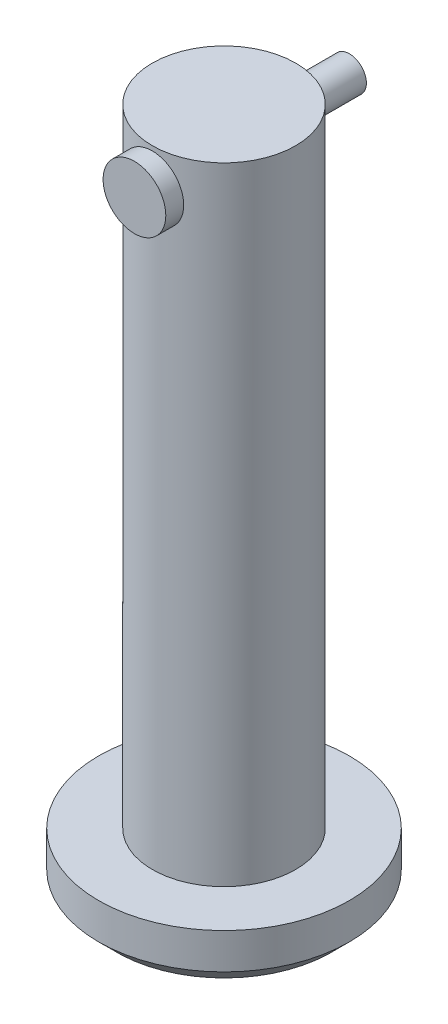
ISO-10303-21;
HEADER;
FILE_DESCRIPTION(('STEP AP214'),'2;1');
FILE_NAME('part.step','',(''),(''),'','','');
FILE_SCHEMA(('AUTOMOTIVE_DESIGN { 1 0 10303 214 1 1 1 1 }'));
ENDSEC;
DATA;
#1=APPLICATION_CONTEXT('core data for automotive mechanical design processes');
#2=APPLICATION_PROTOCOL_DEFINITION('international standard','automotive_design',2000,#1);
#3=PRODUCT_CONTEXT('',#1,'mechanical');
#4=PRODUCT('Part','Part','',(#3));
#5=PRODUCT_RELATED_PRODUCT_CATEGORY('part','',(#4));
#6=PRODUCT_DEFINITION_FORMATION('','',#4);
#7=PRODUCT_DEFINITION_CONTEXT('part definition',#1,'design');
#8=PRODUCT_DEFINITION('design','',#6,#7);
#9=PRODUCT_DEFINITION_SHAPE('','',#8);
#10=(LENGTH_UNIT() NAMED_UNIT(*) SI_UNIT(.MILLI.,.METRE.));
#11=(NAMED_UNIT(*) PLANE_ANGLE_UNIT() SI_UNIT($,.RADIAN.));
#12=(NAMED_UNIT(*) SI_UNIT($,.STERADIAN.) SOLID_ANGLE_UNIT());
#13=UNCERTAINTY_MEASURE_WITH_UNIT(LENGTH_MEASURE(1.E-05),#10,'distance_accuracy_value','');
#14=(GEOMETRIC_REPRESENTATION_CONTEXT(3) GLOBAL_UNCERTAINTY_ASSIGNED_CONTEXT((#13)) GLOBAL_UNIT_ASSIGNED_CONTEXT((#10,
#11,#12)) REPRESENTATION_CONTEXT('',''));
#15=CARTESIAN_POINT('',(0.,0.,0.));
#16=DIRECTION('',(0.,0.,1.));
#17=DIRECTION('',(1.,0.,0.));
#18=AXIS2_PLACEMENT_3D('',#15,#16,#17);
#19=CARTESIAN_POINT('',(0.,33.,-7.));
#20=DIRECTION('',(0.,0.,1.));
#21=DIRECTION('',(1.,0.,0.));
#22=AXIS2_PLACEMENT_3D('',#19,#20,#21);
#23=CYLINDRICAL_SURFACE('',#22,0.95);
#24=CARTESIAN_POINT('',(0.,33.,-7.));
#25=DIRECTION('',(0.,0.,1.));
#26=DIRECTION('',(1.,0.,0.));
#27=AXIS2_PLACEMENT_3D('',#24,#25,#26);
#28=CIRCLE('',#27,0.95);
#29=CARTESIAN_POINT('',(0.95,33.,-7.));
#30=VERTEX_POINT('',#29);
#31=EDGE_CURVE('E11',#30,#30,#28,.T.);
#32=ORIENTED_EDGE('',*,*,#31,.T.);
#33=EDGE_LOOP('',(#32));
#34=FACE_BOUND('',#33,.T.);
#35=CARTESIAN_POINT('',(0.,33.,4.));
#36=DIRECTION('',(0.,0.,1.));
#37=DIRECTION('',(1.,0.,0.));
#38=AXIS2_PLACEMENT_3D('',#35,#36,#37);
#39=CIRCLE('',#38,0.95);
#40=CARTESIAN_POINT('',(0.95,33.,4.));
#41=VERTEX_POINT('',#40);
#42=EDGE_CURVE('E41',#41,#41,#39,.F.);
#43=ORIENTED_EDGE('',*,*,#42,.T.);
#44=EDGE_LOOP('',(#43));
#45=FACE_BOUND('',#44,.T.);
#46=ADVANCED_FACE('F38',(#34,#45),#23,.T.);
#47=CARTESIAN_POINT('',(0.,33.,-7.));
#48=DIRECTION('',(0.,0.,1.));
#49=DIRECTION('',(1.,0.,0.));
#50=AXIS2_PLACEMENT_3D('',#47,#48,#49);
#51=PLANE('',#50);
#52=ORIENTED_EDGE('',*,*,#31,.F.);
#53=EDGE_LOOP('',(#52));
#54=FACE_BOUND('',#53,.T.);
#55=ADVANCED_FACE('F70',(#54),#51,.F.);
#56=CARTESIAN_POINT('',(0.,33.,4.));
#57=DIRECTION('',(0.,0.,1.));
#58=DIRECTION('',(1.,0.,0.));
#59=AXIS2_PLACEMENT_3D('',#56,#57,#58);
#60=CYLINDRICAL_SURFACE('',#59,1.75);
#61=CARTESIAN_POINT('',(0.,33.,4.));
#62=DIRECTION('',(0.,0.,1.));
#63=DIRECTION('',(1.,0.,0.));
#64=AXIS2_PLACEMENT_3D('',#61,#62,#63);
#65=CIRCLE('',#64,1.75);
#66=CARTESIAN_POINT('',(1.75,33.,4.));
#67=VERTEX_POINT('',#66);
#68=EDGE_CURVE('E48',#67,#67,#65,.T.);
#69=ORIENTED_EDGE('',*,*,#68,.T.);
#70=EDGE_LOOP('',(#69));
#71=FACE_BOUND('',#70,.T.);
#72=CARTESIAN_POINT('',(0.,33.,5.));
#73=DIRECTION('',(0.,0.,1.));
#74=DIRECTION('',(1.,0.,0.));
#75=AXIS2_PLACEMENT_3D('',#72,#73,#74);
#76=CIRCLE('',#75,1.75);
#77=CARTESIAN_POINT('',(1.75,33.,5.));
#78=VERTEX_POINT('',#77);
#79=EDGE_CURVE('E50',#78,#78,#76,.T.);
#80=ORIENTED_EDGE('',*,*,#79,.F.);
#81=EDGE_LOOP('',(#80));
#82=FACE_BOUND('',#81,.T.);
#83=ADVANCED_FACE('F56',(#71,#82),#60,.T.);
#84=CARTESIAN_POINT('',(0.,33.,4.));
#85=DIRECTION('',(0.,0.,1.));
#86=DIRECTION('',(1.,0.,0.));
#87=AXIS2_PLACEMENT_3D('',#84,#85,#86);
#88=PLANE('',#87);
#89=ORIENTED_EDGE('',*,*,#42,.F.);
#90=EDGE_LOOP('',(#89));
#91=FACE_BOUND('',#90,.T.);
#92=ORIENTED_EDGE('',*,*,#68,.F.);
#93=EDGE_LOOP('',(#92));
#94=FACE_BOUND('',#93,.T.);
#95=ADVANCED_FACE('F59',(#91,#94),#88,.F.);
#96=CARTESIAN_POINT('',(0.,33.,5.));
#97=DIRECTION('',(0.,0.,1.));
#98=DIRECTION('',(1.,0.,0.));
#99=AXIS2_PLACEMENT_3D('',#96,#97,#98);
#100=PLANE('',#99);
#101=ORIENTED_EDGE('',*,*,#79,.T.);
#102=EDGE_LOOP('',(#101));
#103=FACE_BOUND('',#102,.T.);
#104=ADVANCED_FACE('F61',(#103),#100,.T.);
#105=CLOSED_SHELL('',(#46,#55,#83,#95,#104));
#106=MANIFOLD_SOLID_BREP('B2',#105);
#107=CARTESIAN_POINT('',(0.,35.,0.));
#108=DIRECTION('',(0.,-1.,0.));
#109=DIRECTION('',(0.,0.,-1.));
#110=AXIS2_PLACEMENT_3D('',#107,#108,#109);
#111=CYLINDRICAL_SURFACE('',#110,4.);
#112=CARTESIAN_POINT('',(0.,35.,0.));
#113=DIRECTION('',(0.,1.,0.));
#114=DIRECTION('',(0.,0.,1.));
#115=AXIS2_PLACEMENT_3D('',#112,#113,#114);
#116=CIRCLE('',#115,4.);
#117=CARTESIAN_POINT('',(0.,35.,4.));
#118=VERTEX_POINT('',#117);
#119=EDGE_CURVE('E128',#118,#118,#116,.T.);
#120=ORIENTED_EDGE('',*,*,#119,.F.);
#121=EDGE_LOOP('',(#120));
#122=FACE_BOUND('',#121,.T.);
#123=CARTESIAN_POINT('',(0.,0.,0.));
#124=DIRECTION('',(0.,-1.,0.));
#125=DIRECTION('',(0.,0.,-1.));
#126=AXIS2_PLACEMENT_3D('',#123,#124,#125);
#127=CIRCLE('',#126,4.);
#128=CARTESIAN_POINT('',(0.,0.,-4.));
#129=VERTEX_POINT('',#128);
#130=EDGE_CURVE('E163',#129,#129,#127,.T.);
#131=ORIENTED_EDGE('',*,*,#130,.F.);
#132=EDGE_LOOP('',(#131));
#133=FACE_BOUND('',#132,.T.);
#134=CARTESIAN_POINT('',(-1.,33.,3.87298334620742));
#135=CARTESIAN_POINT('',(-0.9999984314387,32.9447796996432,3.87298440057185));
#136=CARTESIAN_POINT('',(-0.99541049820807,32.8895420405686,3.87417722499278));
#137=CARTESIAN_POINT('',(-0.977209250194447,32.7806529687674,3.87880744892249));
#138=CARTESIAN_POINT('',(-0.963590682698079,32.72700249822,3.8822461547418));
#139=CARTESIAN_POINT('',(-0.927796479849636,32.6228785847122,3.89095489813012));
#140=CARTESIAN_POINT('',(-0.905631891140942,32.5724011378422,3.8962225706936));
#141=CARTESIAN_POINT('',(-0.853408456505404,32.4758756589875,3.90799276818327));
#142=CARTESIAN_POINT('',(-0.823349275424504,32.4298278151688,3.91449534553241));
#143=CARTESIAN_POINT('',(-0.755483370924518,32.3424553418942,3.92816286540368));
#144=CARTESIAN_POINT('',(-0.717534755081558,32.3012425598597,3.93533839048709));
#145=CARTESIAN_POINT('',(-0.635272825640328,32.2256954422561,3.94945150206622));
#146=CARTESIAN_POINT('',(-0.59095891767214,32.1913617497514,3.95638906626691));
#147=CARTESIAN_POINT('',(-0.496458080431566,32.1300898129474,3.96936166208095));
#148=CARTESIAN_POINT('',(-0.446197830478045,32.1032614447354,3.975382749602));
#149=CARTESIAN_POINT('',(-0.341705273717112,32.0584761423388,3.9857232477043));
#150=CARTESIAN_POINT('',(-0.28747355431678,32.0405178992338,3.99004290933747));
#151=CARTESIAN_POINT('',(-0.177743503501667,32.0143408661686,3.99641903539262));
#152=CARTESIAN_POINT('',(-0.122293087819594,32.0059321422694,3.99851957537723));
#153=CARTESIAN_POINT('',(-0.0107315277051123,31.9984966482898,4.00037437642922));
#154=CARTESIAN_POINT('',(0.0453795178152228,31.9994684911162,4.00012898438682));
#155=CARTESIAN_POINT('',(0.155352247172383,32.0106299401001,3.99735237981413));
#156=CARTESIAN_POINT('',(0.209236215601063,32.0206145300215,3.99487200936349));
#157=CARTESIAN_POINT('',(0.314538247413683,32.0491885080194,3.98796334609942));
#158=CARTESIAN_POINT('',(0.365956179370436,32.067778354151,3.98353494959376));
#159=CARTESIAN_POINT('',(0.465406703501804,32.1132010282748,3.97315003880358));
#160=CARTESIAN_POINT('',(0.513404509766501,32.1401068178647,3.96718007878021));
#161=CARTESIAN_POINT('',(0.604275622340485,32.2013422716465,3.9543596152386));
#162=CARTESIAN_POINT('',(0.647148035085502,32.2356732274242,3.94750895860996));
#163=CARTESIAN_POINT('',(0.727774035084955,32.3118834967929,3.93345485507808));
#164=CARTESIAN_POINT('',(0.765357679075198,32.3539419569391,3.92624687810367));
#165=CARTESIAN_POINT('',(0.832976375963018,32.4438399894161,3.91246017406683));
#166=CARTESIAN_POINT('',(0.863011076046016,32.4916798317964,3.90588147642388));
#167=CARTESIAN_POINT('',(0.9147881290226,32.5921160136596,3.89408198732659));
#168=CARTESIAN_POINT('',(0.936489566970494,32.6447342921253,3.88886793490288));
#169=CARTESIAN_POINT('',(0.970685620636343,32.7530341872306,3.88047456055983));
#170=CARTESIAN_POINT('',(0.983182206552911,32.8087151455933,3.87729480324087));
#171=CARTESIAN_POINT('',(0.998331855466071,32.9199838006093,3.87342142415656));
#172=CARTESIAN_POINT('',(1.00123618956785,32.9755351173319,3.87266435637459));
#173=CARTESIAN_POINT('',(0.99780679620622,33.0863287746313,3.87354937392416));
#174=CARTESIAN_POINT('',(0.991473919139521,33.1415711431805,3.87519123840506));
#175=CARTESIAN_POINT('',(0.969970185575067,33.2492457059819,3.88062832781824));
#176=CARTESIAN_POINT('',(0.954945627312701,33.3017090906283,3.8843878809375));
#177=CARTESIAN_POINT('',(0.916647232668251,33.4033725831407,3.89360287308385));
#178=CARTESIAN_POINT('',(0.89337241908502,33.4525723036221,3.89905851299445));
#179=CARTESIAN_POINT('',(0.838708267174624,33.5473765111469,3.91118454837305));
#180=CARTESIAN_POINT('',(0.807168701534253,33.5928915360172,3.91787667442657));
#181=CARTESIAN_POINT('',(0.737060292934456,33.6780753451205,3.93166833228686));
#182=CARTESIAN_POINT('',(0.698490294805438,33.71774316666,3.93876793091388));
#183=CARTESIAN_POINT('',(0.614262720984725,33.7911244170284,3.95278961212643));
#184=CARTESIAN_POINT('',(0.568451952531594,33.8246640250195,3.95970280824734));
#185=CARTESIAN_POINT('',(0.47170268269468,33.8835743467805,3.97238886645493));
#186=CARTESIAN_POINT('',(0.420764448957597,33.9089454866433,3.97816178801584));
#187=CARTESIAN_POINT('',(0.315558201731097,33.9505784138112,3.98788046295326));
#188=CARTESIAN_POINT('',(0.261317381027888,33.9669057137516,3.99183932008964));
#189=CARTESIAN_POINT('',(0.150749760318812,33.9901841338434,3.99754117358315));
#190=CARTESIAN_POINT('',(0.094423365041247,33.9971370634956,3.99928459757363));
#191=CARTESIAN_POINT('',(-0.0170835264433241,34.0013675895755,4.00034169408811));
#192=CARTESIAN_POINT('',(-0.0722538269660308,33.9989017090954,3.99971978880008));
#193=CARTESIAN_POINT('',(-0.181367496414737,33.9849521727057,3.99625896457423));
#194=CARTESIAN_POINT('',(-0.235310901780883,33.9734687849869,3.99342011157094));
#195=CARTESIAN_POINT('',(-0.340171035644813,33.9419477802291,3.98585432853963));
#196=CARTESIAN_POINT('',(-0.391102494581017,33.9219565466854,3.98113764502669));
#197=CARTESIAN_POINT('',(-0.488917053041466,33.8740294209807,3.97031288913382));
#198=CARTESIAN_POINT('',(-0.535799641265048,33.8460925273304,3.96420464137727));
#199=CARTESIAN_POINT('',(-0.625401928423897,33.7822847660029,3.95107249681342));
#200=CARTESIAN_POINT('',(-0.667994988300584,33.7462398570926,3.94403016945647));
#201=CARTESIAN_POINT('',(-0.746615020271249,33.6675771480262,3.92990649053207));
#202=CARTESIAN_POINT('',(-0.782640325068177,33.6249576839021,3.92282512952424));
#203=CARTESIAN_POINT('',(-0.847762026479239,33.5333985857987,3.90927475860683));
#204=CARTESIAN_POINT('',(-0.876716619446591,33.4843558765875,3.90281963730391));
#205=CARTESIAN_POINT('',(-0.92592689661562,33.3819445100772,3.8914395555011));
#206=CARTESIAN_POINT('',(-0.946188909759556,33.3285790338927,3.88651348244814));
#207=CARTESIAN_POINT('',(-0.974422528565571,33.2294229881737,3.87951908741315));
#208=CARTESIAN_POINT('',(-0.983993170595829,33.1841068356176,3.87708663005761));
#209=CARTESIAN_POINT('',(-0.996782292572819,33.0925311309985,3.87381838580358));
#210=CARTESIAN_POINT('',(-1.00000131437052,33.0462716597494,3.87298246270639));
#211=CARTESIAN_POINT('',(-1.,33.,3.87298334620742));
#212=B_SPLINE_CURVE_WITH_KNOTS('',3,(#134,#135,#136,#137,#138,#139,#140,#141,#142,#143,#144,
#145,#146,#147,#148,#149,#150,#151,#152,#153,#154,#155,#156,#157,#158,#159,#160,#161,#162,#163,
#164,#165,#166,#167,#168,#169,#170,#171,#172,#173,#174,#175,#176,#177,#178,#179,#180,#181,#182,
#183,#184,#185,#186,#187,#188,#189,#190,#191,#192,#193,#194,#195,#196,#197,#198,#199,#200,#201,
#202,#203,#204,#205,#206,#207,#208,#209,#210,#211),.UNSPECIFIED.,.T.,.F.,(4,2,2,2,2,2,2,2,2,2,2,
2,2,2,2,2,2,2,2,2,2,2,2,2,2,2,2,2,2,2,2,2,2,2,2,2,2,2,4),(0.,0.165490976675223,
0.331078296534208,0.496452290829161,0.66183330698466,0.830495816734648,0.99917408588221,
1.17020598555442,1.34121263935111,1.50875500394413,1.67627259462682,1.84007305071853,
2.00388222686189,2.16917149698052,2.33448954183839,2.50428186625039,2.67408212476195,
2.84470572799636,3.01529280048094,3.18137429900961,3.34744050869795,3.51078961999957,
3.67415808564842,3.84073138339938,4.00733207550293,4.17810132382402,4.34886166284095,
4.51836829119046,4.6878421955989,4.85273378447257,5.01762046947067,5.18161950620159,
5.34563922291503,5.51358838629103,5.68158012622478,5.85270590910145,6.02370688542922,
6.16239130867207,6.30106390036083),.UNSPECIFIED.);
#213=CARTESIAN_POINT('',(-1.,33.,3.87298334620742));
#214=VERTEX_POINT('',#213);
#215=EDGE_CURVE('E131',#214,#214,#212,.T.);
#216=ORIENTED_EDGE('',*,*,#215,.F.);
#217=EDGE_LOOP('',(#216));
#218=FACE_BOUND('',#217,.T.);
#219=CARTESIAN_POINT('',(0.,34.,-4.));
#220=CARTESIAN_POINT('',(0.0552507257798211,33.9999984495079,-3.99999906578675));
#221=CARTESIAN_POINT('',(0.110518771887176,33.9954056328175,-3.99884385421219));
#222=CARTESIAN_POINT('',(0.219470882513689,33.977183232462,-3.99434742553261));
#223=CARTESIAN_POINT('',(0.27315403124716,33.9635485269748,-3.99100496946646));
#224=CARTESIAN_POINT('',(0.37734724812172,33.9277071643586,-3.98250417554693));
#225=CARTESIAN_POINT('',(0.427861042286672,33.9055108008565,-3.97734801894724));
#226=CARTESIAN_POINT('',(0.524448087936288,33.8532124066368,-3.96576895871729));
#227=CARTESIAN_POINT('',(0.570521189565842,33.823110109254,-3.95934601236034));
#228=CARTESIAN_POINT('',(0.657867951533948,33.7551994735639,-3.94578275727868));
#229=CARTESIAN_POINT('',(0.699037126707383,33.7172589500272,-3.93863138099022));
#230=CARTESIAN_POINT('',(0.774499284802205,33.6350318633941,-3.92449080078353));
#231=CARTESIAN_POINT('',(0.808791491299426,33.5907445847023,-3.91750161525566));
#232=CARTESIAN_POINT('',(0.870017695199357,33.4962698488417,-3.9043651713314));
#233=CARTESIAN_POINT('',(0.896834810616906,33.4460045127931,-3.89823196313737));
#234=CARTESIAN_POINT('',(0.941597939033685,33.3415010588944,-3.88766329874815));
#235=CARTESIAN_POINT('',(0.959545370292889,33.2872635777828,-3.88322757115192));
#236=CARTESIAN_POINT('',(0.985703224536195,33.1775043345317,-3.87666984478367));
#237=CARTESIAN_POINT('',(0.994101512222227,33.1220300693001,-3.87450327383617));
#238=CARTESIAN_POINT('',(1.00150785004524,33.0104209539907,-3.8725957502516));
#239=CARTESIAN_POINT('',(1.00051742787865,32.9542862128676,-3.87285440299096));
#240=CARTESIAN_POINT('',(0.98932434975952,32.8443894615037,-3.87572803664412));
#241=CARTESIAN_POINT('',(0.979345560127013,32.7906029190233,-3.87828575334586));
#242=CARTESIAN_POINT('',(0.950816124602071,32.6854926327258,-3.88537806450989));
#243=CARTESIAN_POINT('',(0.932264868046283,32.6341690646473,-3.88991279980464));
#244=CARTESIAN_POINT('',(0.88692631862477,32.5348413224986,-3.90050075936124));
#245=CARTESIAN_POINT('',(0.860057778155274,32.4868758854736,-3.90656884979614));
#246=CARTESIAN_POINT('',(0.798904184009968,32.3960541934954,-3.91953140564257));
#247=CARTESIAN_POINT('',(0.764617832539224,32.3531988346218,-3.9264260155649));
#248=CARTESIAN_POINT('',(0.688442283120808,32.2725309228704,-3.94050587026521));
#249=CARTESIAN_POINT('',(0.646364172110569,32.2348970066258,-3.94769379651981));
#250=CARTESIAN_POINT('',(0.556407945002461,32.1671858383574,-3.96137310385857));
#251=CARTESIAN_POINT('',(0.50852965180529,32.1371088171576,-3.96786446366277));
#252=CARTESIAN_POINT('',(0.408077259120922,32.0852996091837,-3.97945154729455));
#253=CARTESIAN_POINT('',(0.35548759547241,32.0635964398304,-3.9845424008515));
#254=CARTESIAN_POINT('',(0.247250672095251,32.0293884628603,-3.99271944660946));
#255=CARTESIAN_POINT('',(0.191603999433652,32.0168818957212,-3.99580602226187));
#256=CARTESIAN_POINT('',(0.0803599802600139,32.0016949562941,-3.9995699951425));
#257=CARTESIAN_POINT('',(0.0247978133254694,31.9987713159498,-4.00030702338852));
#258=CARTESIAN_POINT('',(-0.0860219165343418,32.0021660013703,-3.999458698763));
#259=CARTESIAN_POINT('',(-0.141279506429733,32.0084834951994,-3.99787355494564));
#260=CARTESIAN_POINT('',(-0.24907617918433,32.0299806055943,-3.99259720751571));
#261=CARTESIAN_POINT('',(-0.301643412645839,32.0450275089847,-3.98893756123874));
#262=CARTESIAN_POINT('',(-0.40350486163501,32.0834047226856,-3.97992471089423));
#263=CARTESIAN_POINT('',(-0.452798746021758,32.1067358695421,-3.97457133579928));
#264=CARTESIAN_POINT('',(-0.547682089619899,32.1614907525831,-3.96262205284207));
#265=CARTESIAN_POINT('',(-0.593190294557221,32.1930507415978,-3.95600578244621));
#266=CARTESIAN_POINT('',(-0.678351075762165,32.2631932725313,-3.94229672791613));
#267=CARTESIAN_POINT('',(-0.71800263931534,32.3017770264113,-3.93520386167803));
#268=CARTESIAN_POINT('',(-0.791327045381821,32.3860013072296,-3.92112637973847));
#269=CARTESIAN_POINT('',(-0.824829245081355,32.4317918020016,-3.91414869458187));
#270=CARTESIAN_POINT('',(-0.883673839341799,32.5284884229771,-3.90128585584826));
#271=CARTESIAN_POINT('',(-0.909016596105292,32.5793943219732,-3.89540065378017));
#272=CARTESIAN_POINT('',(-0.950634280406197,32.6846038149421,-3.88545396489777));
#273=CARTESIAN_POINT('',(-0.966962931102711,32.7388850855627,-3.88138170194604));
#274=CARTESIAN_POINT('',(-0.990230439969186,32.8495397585927,-3.87551162726789));
#275=CARTESIAN_POINT('',(-0.997171351652438,32.9059127006883,-3.87371331813291));
#276=CARTESIAN_POINT('',(-1.00135906022266,33.0174140159035,-3.87263267469304));
#277=CARTESIAN_POINT('',(-0.998878598520081,33.0725316234165,-3.87327955152176));
#278=CARTESIAN_POINT('',(-0.984918185541914,33.1815359257786,-3.87685272671895));
#279=CARTESIAN_POINT('',(-0.973438415124514,33.2354226453424,-3.87977897927904));
#280=CARTESIAN_POINT('',(-0.941954212961864,33.3401389727103,-3.88754173788482));
#281=CARTESIAN_POINT('',(-0.922000936453585,33.3909848701601,-3.89236676824206));
#282=CARTESIAN_POINT('',(-0.874176609070049,33.4886435884758,-3.90338503816552));
#283=CARTESIAN_POINT('',(-0.846304460022793,33.5354558487913,-3.90957846747182));
#284=CARTESIAN_POINT('',(-0.782578499091425,33.6250364193347,-3.92283756175675));
#285=CARTESIAN_POINT('',(-0.746535441941504,33.6676673822827,-3.92992176554505));
#286=CARTESIAN_POINT('',(-0.667859580793158,33.7463646965303,-3.94405351497524));
#287=CARTESIAN_POINT('',(-0.625225214174097,33.782429486742,-3.95110105151373));
#288=CARTESIAN_POINT('',(-0.533645057801726,33.8476075390431,-3.96451770431775));
#289=CARTESIAN_POINT('',(-0.484598948210922,33.8765830757811,-3.97087222243912));
#290=CARTESIAN_POINT('',(-0.382177373006982,33.9258316419604,-3.98203283316746));
#291=CARTESIAN_POINT('',(-0.328805042291159,33.946110907099,-3.98684003466521));
#292=CARTESIAN_POINT('',(-0.229606835495648,33.9743812202198,-3.99365373043694));
#293=CARTESIAN_POINT('',(-0.184253447272046,33.983967495369,-3.9960172336846));
#294=CARTESIAN_POINT('',(-0.0926040476908554,33.996777295748,-3.99919070154632));
#295=CARTESIAN_POINT('',(-0.0463081074950776,34.0000012995369,-4.00000078300596));
#296=CARTESIAN_POINT('',(0.,34.,-4.));
#297=B_SPLINE_CURVE_WITH_KNOTS('',3,(#219,#220,#221,#222,#223,#224,#225,#226,#227,#228,#229,
#230,#231,#232,#233,#234,#235,#236,#237,#238,#239,#240,#241,#242,#243,#244,#245,#246,#247,#248,
#249,#250,#251,#252,#253,#254,#255,#256,#257,#258,#259,#260,#261,#262,#263,#264,#265,#266,#267,
#268,#269,#270,#271,#272,#273,#274,#275,#276,#277,#278,#279,#280,#281,#282,#283,#284,#285,#286,
#287,#288,#289,#290,#291,#292,#293,#294,#295,#296),.UNSPECIFIED.,.T.,.F.,(4,2,2,2,2,2,2,2,2,2,2,
2,2,2,2,2,2,2,2,2,2,2,2,2,2,2,2,2,2,2,2,2,2,2,2,2,2,2,4),(0.,0.165582474981261,
0.331258825175935,0.496736601524073,0.662219960112887,0.830762902914266,0.999324863867081,
1.17039098363872,1.34142974112912,1.50904196732954,1.67662692075132,1.84014998004679,
2.00368468977359,2.16887018582587,2.33408460557443,2.50401000646014,2.67394059705499,
2.84445486006077,3.01493649125763,3.18105539299518,3.34715934075162,3.51080183009359,
3.67446084881527,3.84102391710235,4.0076157533868,4.17829672802984,4.34897012499672,
4.51861503076025,4.68822282168272,4.85295853599075,5.01769093970689,5.18144267039632,
5.34521712091268,5.51326384273274,5.68135046513612,5.85248123666393,6.02348909214234,
6.16228161961433,6.3010637069536),.UNSPECIFIED.);
#298=CARTESIAN_POINT('',(0.,34.,-4.));
#299=VERTEX_POINT('',#298);
#300=EDGE_CURVE('E115',#299,#299,#297,.T.);
#301=ORIENTED_EDGE('',*,*,#300,.F.);
#302=EDGE_LOOP('',(#301));
#303=FACE_BOUND('',#302,.T.);
#304=ADVANCED_FACE('F111',(#122,#133,#218,#303),#111,.T.);
#305=CARTESIAN_POINT('',(0.,35.,0.));
#306=DIRECTION('',(0.,1.,0.));
#307=DIRECTION('',(0.,0.,1.));
#308=AXIS2_PLACEMENT_3D('',#305,#306,#307);
#309=PLANE('',#308);
#310=ORIENTED_EDGE('',*,*,#119,.T.);
#311=EDGE_LOOP('',(#310));
#312=FACE_BOUND('',#311,.T.);
#313=ADVANCED_FACE('F154',(#312),#309,.T.);
#314=CARTESIAN_POINT('',(0.,-3.,0.));
#315=DIRECTION('',(0.,1.,0.));
#316=DIRECTION('',(0.,0.,1.));
#317=AXIS2_PLACEMENT_3D('',#314,#315,#316);
#318=CYLINDRICAL_SURFACE('',#317,7.);
#319=CARTESIAN_POINT('',(0.,-1.99999999999999,0.));
#320=DIRECTION('',(0.,-1.,0.));
#321=DIRECTION('',(0.,0.,-1.));
#322=AXIS2_PLACEMENT_3D('',#319,#320,#321);
#323=CIRCLE('',#322,7.);
#324=CARTESIAN_POINT('',(0.,-1.99999999999999,-7.));
#325=VERTEX_POINT('',#324);
#326=EDGE_CURVE('E37',#325,#325,#323,.F.);
#327=ORIENTED_EDGE('',*,*,#326,.T.);
#328=EDGE_LOOP('',(#327));
#329=FACE_BOUND('',#328,.T.);
#330=CARTESIAN_POINT('',(0.,0.,0.));
#331=DIRECTION('',(0.,-1.,0.));
#332=DIRECTION('',(0.,0.,-1.));
#333=AXIS2_PLACEMENT_3D('',#330,#331,#332);
#334=CIRCLE('',#333,7.);
#335=CARTESIAN_POINT('',(0.,0.,-7.));
#336=VERTEX_POINT('',#335);
#337=EDGE_CURVE('E165',#336,#336,#334,.T.);
#338=ORIENTED_EDGE('',*,*,#337,.T.);
#339=EDGE_LOOP('',(#338));
#340=FACE_BOUND('',#339,.T.);
#341=ADVANCED_FACE('F148',(#329,#340),#318,.T.);
#342=CARTESIAN_POINT('',(0.,-3.,0.));
#343=DIRECTION('',(0.,-1.,0.));
#344=DIRECTION('',(0.,0.,-1.));
#345=AXIS2_PLACEMENT_3D('',#342,#343,#344);
#346=PLANE('',#345);
#347=CARTESIAN_POINT('',(0.,-3.,0.));
#348=DIRECTION('',(0.,-1.,0.));
#349=DIRECTION('',(0.,0.,-1.));
#350=AXIS2_PLACEMENT_3D('',#347,#348,#349);
#351=CIRCLE('',#350,6.);
#352=CARTESIAN_POINT('',(0.,-3.,-6.));
#353=VERTEX_POINT('',#352);
#354=EDGE_CURVE('E123',#353,#353,#351,.T.);
#355=ORIENTED_EDGE('',*,*,#354,.T.);
#356=EDGE_LOOP('',(#355));
#357=FACE_BOUND('',#356,.T.);
#358=ADVANCED_FACE('F143',(#357),#346,.T.);
#359=CARTESIAN_POINT('',(0.,0.,0.));
#360=DIRECTION('',(0.,-1.,0.));
#361=DIRECTION('',(0.,0.,-1.));
#362=AXIS2_PLACEMENT_3D('',#359,#360,#361);
#363=PLANE('',#362);
#364=ORIENTED_EDGE('',*,*,#130,.T.);
#365=EDGE_LOOP('',(#364));
#366=FACE_BOUND('',#365,.T.);
#367=ORIENTED_EDGE('',*,*,#337,.F.);
#368=EDGE_LOOP('',(#367));
#369=FACE_BOUND('',#368,.T.);
#370=ADVANCED_FACE('F147',(#366,#369),#363,.F.);
#371=CARTESIAN_POINT('',(0.,-3.,0.));
#372=DIRECTION('',(0.,1.,0.));
#373=DIRECTION('',(0.,0.,1.));
#374=AXIS2_PLACEMENT_3D('',#371,#372,#373);
#375=CONICAL_SURFACE('',#374,6.,0.785398163397447);
#376=ORIENTED_EDGE('',*,*,#326,.F.);
#377=EDGE_LOOP('',(#376));
#378=FACE_BOUND('',#377,.T.);
#379=ORIENTED_EDGE('',*,*,#354,.F.);
#380=EDGE_LOOP('',(#379));
#381=FACE_BOUND('',#380,.T.);
#382=ADVANCED_FACE('F113',(#378,#381),#375,.T.);
#383=CARTESIAN_POINT('',(0.,33.,10.));
#384=DIRECTION('',(0.,0.,-1.));
#385=DIRECTION('',(-1.,0.,0.));
#386=AXIS2_PLACEMENT_3D('',#383,#384,#385);
#387=CYLINDRICAL_SURFACE('',#386,1.);
#388=ORIENTED_EDGE('',*,*,#215,.T.);
#389=EDGE_LOOP('',(#388));
#390=FACE_BOUND('',#389,.T.);
#391=ORIENTED_EDGE('',*,*,#300,.T.);
#392=EDGE_LOOP('',(#391));
#393=FACE_BOUND('',#392,.T.);
#394=ADVANCED_FACE('F138',(#390,#393),#387,.F.);
#395=CLOSED_SHELL('',(#304,#313,#341,#358,#370,#382,#394));
#396=MANIFOLD_SOLID_BREP('B6',#395);
#397=ADVANCED_BREP_SHAPE_REPRESENTATION('',(#18,#106,#396),#14);
#398=SHAPE_DEFINITION_REPRESENTATION(#9,#397);
ENDSEC;
END-ISO-10303-21;
